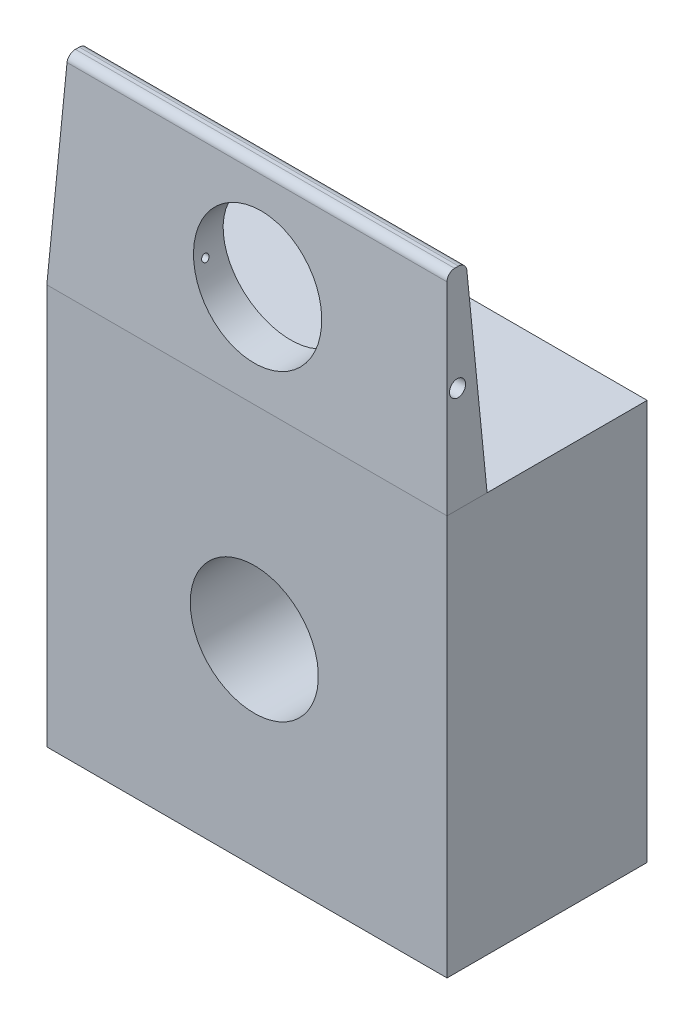
ISO-10303-21;
HEADER;
FILE_DESCRIPTION(('STEP AP214'),'2;1');
FILE_NAME('part.step','',(''),(''),'','','');
FILE_SCHEMA(('AUTOMOTIVE_DESIGN { 1 0 10303 214 1 1 1 1 }'));
ENDSEC;
DATA;
#1=APPLICATION_CONTEXT('core data for automotive mechanical design processes');
#2=APPLICATION_PROTOCOL_DEFINITION('international standard','automotive_design',2000,#1);
#3=PRODUCT_CONTEXT('',#1,'mechanical');
#4=PRODUCT('Part','Part','',(#3));
#5=PRODUCT_RELATED_PRODUCT_CATEGORY('part','',(#4));
#6=PRODUCT_DEFINITION_FORMATION('','',#4);
#7=PRODUCT_DEFINITION_CONTEXT('part definition',#1,'design');
#8=PRODUCT_DEFINITION('design','',#6,#7);
#9=PRODUCT_DEFINITION_SHAPE('','',#8);
#10=(LENGTH_UNIT() NAMED_UNIT(*) SI_UNIT(.MILLI.,.METRE.));
#11=(NAMED_UNIT(*) PLANE_ANGLE_UNIT() SI_UNIT($,.RADIAN.));
#12=(NAMED_UNIT(*) SI_UNIT($,.STERADIAN.) SOLID_ANGLE_UNIT());
#13=UNCERTAINTY_MEASURE_WITH_UNIT(LENGTH_MEASURE(1.E-05),#10,'distance_accuracy_value','');
#14=(GEOMETRIC_REPRESENTATION_CONTEXT(3) GLOBAL_UNCERTAINTY_ASSIGNED_CONTEXT((#13)) GLOBAL_UNIT_ASSIGNED_CONTEXT((#10,
#11,#12)) REPRESENTATION_CONTEXT('',''));
#15=CARTESIAN_POINT('',(0.,0.,0.));
#16=DIRECTION('',(0.,0.,1.));
#17=DIRECTION('',(1.,0.,0.));
#18=AXIS2_PLACEMENT_3D('',#15,#16,#17);
#19=CARTESIAN_POINT('',(90.8249405268785,103.104022899305,89.2888578511315));
#20=DIRECTION('',(0.998629534754574,0.0523359562429438,0.));
#21=DIRECTION('',(-0.0523359562429439,0.998629534754574,0.));
#22=AXIS2_PLACEMENT_3D('',#19,#20,#21);
#23=PLANE('',#22);
#24=CARTESIAN_POINT('',(89.5147460448025,128.104022899305,95.3565363077755));
#25=DIRECTION('',(0.998629534754574,0.0523359562429439,0.));
#26=DIRECTION('',(-0.0523359562429439,0.998629534754574,0.));
#27=AXIS2_PLACEMENT_3D('',#24,#25,#26);
#28=CIRCLE('',#27,2.);
#29=CARTESIAN_POINT('',(89.4100741323166,130.101281968814,95.3565363077755));
#30=VERTEX_POINT('',#29);
#31=EDGE_CURVE('P0_E131',#30,#30,#28,.T.);
#32=ORIENTED_EDGE('',*,*,#31,.F.);
#33=EDGE_LOOP('',(#32));
#34=FACE_BOUND('',#33,.T.);
#35=DIRECTION('',(0.0522644276887139,-0.997264688634237,-0.0522644276887139));
#36=VECTOR('',#35,1.);
#37=CARTESIAN_POINT('',(90.5517834867156,108.316169719868,89.5620148912944));
#38=LINE('',#37,#36);
#39=CARTESIAN_POINT('',(88.3038814988058,151.208694811791,91.8099168792042));
#40=VERTEX_POINT('',#39);
#41=CARTESIAN_POINT('',(90.8249405268785,103.104022899305,89.2888578511315));
#42=VERTEX_POINT('',#41);
#43=EDGE_CURVE('P0_E74',#40,#42,#38,.T.);
#44=ORIENTED_EDGE('',*,*,#43,.F.);
#45=CARTESIAN_POINT('',(88.3093671212925,151.104022899305,93.8071759487134));
#46=DIRECTION('',(0.998629534754574,0.0523359562429438,0.));
#47=DIRECTION('',(-0.0523359562429439,0.998629534754574,0.));
#48=AXIS2_PLACEMENT_3D('',#45,#46,#47);
#49=ELLIPSE('',#48,2.00274469199584,2.);
#50=CARTESIAN_POINT('',(88.2045515627264,153.104022899305,93.8071759487134));
#51=VERTEX_POINT('',#50);
#52=EDGE_CURVE('P0_E30',#40,#51,#49,.T.);
#53=ORIENTED_EDGE('',*,*,#52,.T.);
#54=DIRECTION('',(0.,0.,1.));
#55=VECTOR('',#54,1.);
#56=CARTESIAN_POINT('',(88.2045515627264,153.104022899305,89.2888578511315));
#57=LINE('',#56,#55);
#58=CARTESIAN_POINT('',(88.2045515627264,153.104022899305,94.7705397535497));
#59=VERTEX_POINT('',#58);
#60=EDGE_CURVE('P0_E104',#59,#51,#57,.F.);
#61=ORIENTED_EDGE('',*,*,#60,.F.);
#62=CARTESIAN_POINT('',(88.3093671212925,151.104022899305,94.7705397535497));
#63=DIRECTION('',(0.998629534754574,0.0523359562429438,0.));
#64=DIRECTION('',(0.0523359562429439,-0.998629534754574,0.));
#65=AXIS2_PLACEMENT_3D('',#62,#63,#64);
#66=ELLIPSE('',#65,2.00274469199584,2.);
#67=CARTESIAN_POINT('',(88.3038814988058,151.208694811791,96.7677988230589));
#68=VERTEX_POINT('',#67);
#69=EDGE_CURVE('P0_E38',#59,#68,#66,.T.);
#70=ORIENTED_EDGE('',*,*,#69,.T.);
#71=DIRECTION('',(0.0522644276887139,-0.997264688634237,0.0522644276887139));
#72=VECTOR('',#71,1.);
#73=CARTESIAN_POINT('',(90.7976248228622,103.625237581361,99.2615421471153));
#74=LINE('',#73,#72);
#75=CARTESIAN_POINT('',(90.8249405268785,103.104022899305,99.2888578511315));
#76=VERTEX_POINT('',#75);
#77=EDGE_CURVE('P0_E92',#68,#76,#74,.T.);
#78=ORIENTED_EDGE('',*,*,#77,.T.);
#79=DIRECTION('',(0.,0.,-1.));
#80=VECTOR('',#79,1.);
#81=CARTESIAN_POINT('',(90.8249405268785,103.104022899305,89.2888578511315));
#82=LINE('',#81,#80);
#83=EDGE_CURVE('P0_E88',#76,#42,#82,.T.);
#84=ORIENTED_EDGE('',*,*,#83,.T.);
#85=EDGE_LOOP('',(#44,#53,#61,#70,#78,#84));
#86=FACE_BOUND('',#85,.T.);
#87=ADVANCED_FACE('P0_F16',(#34,#86),#23,.T.);
#88=CARTESIAN_POINT('',(-9.17505947312153,103.104022899305,89.2888578511315));
#89=DIRECTION('',(0.,0.0523359562429438,-0.998629534754574));
#90=DIRECTION('',(0.,0.998629534754574,0.0523359562429439));
#91=AXIS2_PLACEMENT_3D('',#88,#89,#90);
#92=PLANE('',#91);
#93=CARTESIAN_POINT('',(42.2017689149086,128.069761268169,90.5972567572051));
#94=DIRECTION('',(0.,0.0523359562429439,-0.998629534754574));
#95=DIRECTION('',(0.,0.998629534754574,0.0523359562429439));
#96=AXIS2_PLACEMENT_3D('',#93,#94,#95);
#97=CIRCLE('',#96,16.);
#98=CARTESIAN_POINT('',(42.2017689149086,144.047833824243,91.4346320570922));
#99=VERTEX_POINT('',#98);
#100=EDGE_CURVE('P0_E97',#99,#99,#97,.T.);
#101=ORIENTED_EDGE('',*,*,#100,.F.);
#102=EDGE_LOOP('',(#101));
#103=FACE_BOUND('',#102,.T.);
#104=DIRECTION('',(-0.052264427688714,-0.997264688634237,-0.0522644276887139));
#105=VECTOR('',#104,1.);
#106=CARTESIAN_POINT('',(-9.17505947312153,103.104022899305,89.2888578511315));
#107=LINE('',#106,#105);
#108=CARTESIAN_POINT('',(-6.65400044504886,151.208694811791,91.8099168792042));
#109=VERTEX_POINT('',#108);
#110=CARTESIAN_POINT('',(-9.17505947312153,103.104022899305,89.2888578511315));
#111=VERTEX_POINT('',#110);
#112=EDGE_CURVE('P0_E82',#109,#111,#107,.T.);
#113=ORIENTED_EDGE('',*,*,#112,.F.);
#114=DIRECTION('',(-1.,0.,0.));
#115=VECTOR('',#114,1.);
#116=CARTESIAN_POINT('',(88.2045515627264,151.208694811791,91.8099168792042));
#117=LINE('',#116,#115);
#118=EDGE_CURVE('P0_E46',#109,#40,#117,.F.);
#119=ORIENTED_EDGE('',*,*,#118,.T.);
#120=ORIENTED_EDGE('',*,*,#43,.T.);
#121=DIRECTION('',(-1.,0.,0.));
#122=VECTOR('',#121,1.);
#123=CARTESIAN_POINT('',(-9.17505947312153,103.104022899305,89.2888578511315));
#124=LINE('',#123,#122);
#125=EDGE_CURVE('P0_E77',#42,#111,#124,.T.);
#126=ORIENTED_EDGE('',*,*,#125,.T.);
#127=EDGE_LOOP('',(#113,#119,#120,#126));
#128=FACE_BOUND('',#127,.T.);
#129=ADVANCED_FACE('P0_F76',(#103,#128),#92,.T.);
#130=CARTESIAN_POINT('',(-9.17505947312153,103.104022899305,89.2888578511315));
#131=DIRECTION('',(-0.998629534754574,0.0523359562429438,0.));
#132=DIRECTION('',(-0.0523359562429439,-0.998629534754574,0.));
#133=AXIS2_PLACEMENT_3D('',#130,#131,#132);
#134=PLANE('',#133);
#135=CARTESIAN_POINT('',(-8.13303374362537,122.987058275951,95.3565363077755));
#136=DIRECTION('',(-0.998629534754574,0.0523359562429438,0.));
#137=DIRECTION('',(0.0523359562429438,0.998629534754574,0.));
#138=AXIS2_PLACEMENT_3D('',#135,#136,#137);
#139=ELLIPSE('',#138,0.29482816245339,0.293212569488019);
#140=CARTESIAN_POINT('',(-8.11760362981602,123.281482386654,95.3565363077755));
#141=VERTEX_POINT('',#140);
#142=EDGE_CURVE('P0_E240',#141,#141,#139,.F.);
#143=ORIENTED_EDGE('',*,*,#142,.T.);
#144=EDGE_LOOP('',(#143));
#145=FACE_BOUND('',#144,.T.);
#146=DIRECTION('',(0.,0.,-1.));
#147=VECTOR('',#146,1.);
#148=CARTESIAN_POINT('',(-6.55467050896948,153.104022899305,89.2888578511315));
#149=LINE('',#148,#147);
#150=CARTESIAN_POINT('',(-6.55467050896948,153.104022899305,93.8071759487134));
#151=VERTEX_POINT('',#150);
#152=CARTESIAN_POINT('',(-6.55467050896947,153.104022899305,94.7705397535497));
#153=VERTEX_POINT('',#152);
#154=EDGE_CURVE('P0_E108',#151,#153,#149,.F.);
#155=ORIENTED_EDGE('',*,*,#154,.F.);
#156=CARTESIAN_POINT('',(-6.65948606753556,151.104022899305,93.8071759487134));
#157=DIRECTION('',(-0.998629534754574,0.0523359562429438,0.));
#158=DIRECTION('',(-0.0523359562429439,-0.998629534754574,0.));
#159=AXIS2_PLACEMENT_3D('',#156,#157,#158);
#160=ELLIPSE('',#159,2.00274469199584,2.);
#161=EDGE_CURVE('P0_E122',#151,#109,#160,.T.);
#162=ORIENTED_EDGE('',*,*,#161,.T.);
#163=ORIENTED_EDGE('',*,*,#112,.T.);
#164=DIRECTION('',(0.,0.,1.));
#165=VECTOR('',#164,1.);
#166=CARTESIAN_POINT('',(-9.17505947312153,103.104022899305,89.2888578511315));
#167=LINE('',#166,#165);
#168=CARTESIAN_POINT('',(-9.17505947312153,103.104022899305,99.2888578511315));
#169=VERTEX_POINT('',#168);
#170=EDGE_CURVE('P0_E90',#111,#169,#167,.T.);
#171=ORIENTED_EDGE('',*,*,#170,.T.);
#172=DIRECTION('',(-0.0522644276887139,-0.997264688634237,0.0522644276887139));
#173=VECTOR('',#172,1.);
#174=CARTESIAN_POINT('',(-9.17505947312153,103.104022899305,99.2888578511315));
#175=LINE('',#174,#173);
#176=CARTESIAN_POINT('',(-6.65400044504886,151.208694811791,96.7677988230589));
#177=VERTEX_POINT('',#176);
#178=EDGE_CURVE('P0_E107',#177,#169,#175,.T.);
#179=ORIENTED_EDGE('',*,*,#178,.F.);
#180=CARTESIAN_POINT('',(-6.65948606753555,151.104022899305,94.7705397535497));
#181=DIRECTION('',(-0.998629534754574,0.0523359562429438,0.));
#182=DIRECTION('',(0.0523359562429439,0.998629534754574,0.));
#183=AXIS2_PLACEMENT_3D('',#180,#181,#182);
#184=ELLIPSE('',#183,2.00274469199584,2.);
#185=EDGE_CURVE('P0_E120',#177,#153,#184,.T.);
#186=ORIENTED_EDGE('',*,*,#185,.T.);
#187=EDGE_LOOP('',(#155,#162,#163,#171,#179,#186));
#188=FACE_BOUND('',#187,.T.);
#189=ADVANCED_FACE('P0_F154',(#145,#188),#134,.T.);
#190=CARTESIAN_POINT('',(-9.17505947312153,103.104022899305,99.2888578511315));
#191=DIRECTION('',(0.,0.0523359562429438,0.998629534754574));
#192=DIRECTION('',(0.,-0.998629534754574,0.0523359562429439));
#193=AXIS2_PLACEMENT_3D('',#190,#191,#192);
#194=PLANE('',#193);
#195=CARTESIAN_POINT('',(42.2017689149086,127.681758358286,98.0007933159203));
#196=DIRECTION('',(0.,0.0523359562429438,0.998629534754574));
#197=DIRECTION('',(0.,0.998629534754574,-0.0523359562429439));
#198=AXIS2_PLACEMENT_3D('',#195,#196,#197);
#199=ELLIPSE('',#198,16.0881324730163,16.);
#200=CARTESIAN_POINT('',(42.2017689149086,143.747842604884,97.1588055187818));
#201=VERTEX_POINT('',#200);
#202=EDGE_CURVE('P0_E94',#201,#201,#199,.F.);
#203=ORIENTED_EDGE('',*,*,#202,.T.);
#204=EDGE_LOOP('',(#203));
#205=FACE_BOUND('',#204,.T.);
#206=ORIENTED_EDGE('',*,*,#77,.F.);
#207=DIRECTION('',(1.,0.,0.));
#208=VECTOR('',#207,1.);
#209=CARTESIAN_POINT('',(-6.55467050896946,151.208694811791,96.7677988230589));
#210=LINE('',#209,#208);
#211=EDGE_CURVE('P0_E10',#68,#177,#210,.F.);
#212=ORIENTED_EDGE('',*,*,#211,.T.);
#213=ORIENTED_EDGE('',*,*,#178,.T.);
#214=DIRECTION('',(1.,0.,0.));
#215=VECTOR('',#214,1.);
#216=CARTESIAN_POINT('',(-9.17505947312153,103.104022899305,99.2888578511315));
#217=LINE('',#216,#215);
#218=EDGE_CURVE('P0_E103',#169,#76,#217,.T.);
#219=ORIENTED_EDGE('',*,*,#218,.T.);
#220=EDGE_LOOP('',(#206,#212,#213,#219));
#221=FACE_BOUND('',#220,.T.);
#222=ADVANCED_FACE('P0_F160',(#205,#221),#194,.T.);
#223=CARTESIAN_POINT('',(40.8249405268785,153.104022899305,94.2888578511315));
#224=DIRECTION('',(0.,1.,0.));
#225=DIRECTION('',(0.,0.,1.));
#226=AXIS2_PLACEMENT_3D('',#223,#224,#225);
#227=PLANE('',#226);
#228=ORIENTED_EDGE('',*,*,#60,.T.);
#229=DIRECTION('',(1.,0.,0.));
#230=VECTOR('',#229,1.);
#231=CARTESIAN_POINT('',(-6.55467050896946,153.104022899305,93.8071759487134));
#232=LINE('',#231,#230);
#233=EDGE_CURVE('P0_E117',#51,#151,#232,.F.);
#234=ORIENTED_EDGE('',*,*,#233,.T.);
#235=ORIENTED_EDGE('',*,*,#154,.T.);
#236=DIRECTION('',(-1.,0.,0.));
#237=VECTOR('',#236,1.);
#238=CARTESIAN_POINT('',(88.2045515627264,153.104022899305,94.7705397535497));
#239=LINE('',#238,#237);
#240=EDGE_CURVE('P0_E81',#153,#59,#239,.F.);
#241=ORIENTED_EDGE('',*,*,#240,.T.);
#242=EDGE_LOOP('',(#228,#234,#235,#241));
#243=FACE_BOUND('',#242,.T.);
#244=ADVANCED_FACE('P0_F163',(#243),#227,.T.);
#245=CARTESIAN_POINT('',(40.8249405268785,103.104022899305,94.2888578511315));
#246=DIRECTION('',(0.,1.,0.));
#247=DIRECTION('',(0.,0.,1.));
#248=AXIS2_PLACEMENT_3D('',#245,#246,#247);
#249=PLANE('',#248);
#250=ORIENTED_EDGE('',*,*,#83,.F.);
#251=ORIENTED_EDGE('',*,*,#218,.F.);
#252=ORIENTED_EDGE('',*,*,#170,.F.);
#253=ORIENTED_EDGE('',*,*,#125,.F.);
#254=EDGE_LOOP('',(#250,#251,#252,#253));
#255=FACE_BOUND('',#254,.T.);
#256=ADVANCED_FACE('P0_F86',(#255),#249,.F.);
#257=CARTESIAN_POINT('',(40.8249405268785,151.104022899305,93.8071759487134));
#258=DIRECTION('',(-1.,0.,0.));
#259=DIRECTION('',(0.,0.,1.));
#260=AXIS2_PLACEMENT_3D('',#257,#258,#259);
#261=CYLINDRICAL_SURFACE('',#260,2.);
#262=ORIENTED_EDGE('',*,*,#52,.F.);
#263=ORIENTED_EDGE('',*,*,#118,.F.);
#264=ORIENTED_EDGE('',*,*,#161,.F.);
#265=ORIENTED_EDGE('',*,*,#233,.F.);
#266=EDGE_LOOP('',(#262,#263,#264,#265));
#267=FACE_BOUND('',#266,.T.);
#268=ADVANCED_FACE('P0_F167',(#267),#261,.T.);
#269=CARTESIAN_POINT('',(40.8249405268785,151.104022899305,94.7705397535497));
#270=DIRECTION('',(1.,0.,0.));
#271=DIRECTION('',(0.,0.,-1.));
#272=AXIS2_PLACEMENT_3D('',#269,#270,#271);
#273=CYLINDRICAL_SURFACE('',#272,2.);
#274=ORIENTED_EDGE('',*,*,#185,.F.);
#275=ORIENTED_EDGE('',*,*,#211,.F.);
#276=ORIENTED_EDGE('',*,*,#69,.F.);
#277=ORIENTED_EDGE('',*,*,#240,.F.);
#278=EDGE_LOOP('',(#274,#275,#276,#277));
#279=FACE_BOUND('',#278,.T.);
#280=ADVANCED_FACE('P0_F18',(#279),#273,.T.);
#281=CARTESIAN_POINT('',(42.2017689149086,125.452963456022,140.528733494934));
#282=DIRECTION('',(0.,0.0523359562429439,-0.998629534754574));
#283=DIRECTION('',(0.,0.998629534754574,0.0523359562429439));
#284=AXIS2_PLACEMENT_3D('',#281,#282,#283);
#285=CYLINDRICAL_SURFACE('',#284,16.);
#286=CARTESIAN_POINT('',(26.6196307910238,124.218271834449,94.6756667232217));
#287=CARTESIAN_POINT('',(26.6279675501686,124.180753576273,94.7082974656234));
#288=CARTESIAN_POINT('',(26.6357795470047,124.145879384237,94.7441523480832));
#289=CARTESIAN_POINT('',(26.6500012714397,124.082445380417,94.8213589319066));
#290=CARTESIAN_POINT('',(26.6564095994527,124.053891870632,94.8627160540739));
#291=CARTESIAN_POINT('',(26.6675145702616,124.003969225349,94.9497931300925));
#292=CARTESIAN_POINT('',(26.6722107437612,123.982602059733,94.9955142757829));
#293=CARTESIAN_POINT('',(26.6796509586733,123.947731140855,95.0900010396463));
#294=CARTESIAN_POINT('',(26.6823955245821,123.93422527504,95.1387658360003));
#295=CARTESIAN_POINT('',(26.6857717238884,123.915603537764,95.2373386195804));
#296=CARTESIAN_POINT('',(26.6864281753469,123.910389490391,95.2871272195898));
#297=CARTESIAN_POINT('',(26.6856647075258,123.908198579424,95.3868691438478));
#298=CARTESIAN_POINT('',(26.6842448168696,123.911221602279,95.4368224658162));
#299=CARTESIAN_POINT('',(26.6794183637063,123.925352408689,95.5351408155644));
#300=CARTESIAN_POINT('',(26.6760246546051,123.936407999585,95.5835140003801));
#301=CARTESIAN_POINT('',(26.6674298769446,123.966196836982,95.677663955649));
#302=CARTESIAN_POINT('',(26.6622287464894,123.98493034642,95.7234406371213));
#303=CARTESIAN_POINT('',(26.6502131443304,124.029712659688,95.8115513874514));
#304=CARTESIAN_POINT('',(26.6433847363172,124.055825037799,95.8538512203277));
#305=CARTESIAN_POINT('',(26.6284510493478,124.114534657453,95.9334256158435));
#306=CARTESIAN_POINT('',(26.6203456570602,124.147132474643,95.9706997319085));
#307=CARTESIAN_POINT('',(26.6030547022379,124.21851478584,96.0398445884039));
#308=CARTESIAN_POINT('',(26.5938529808559,124.257395906755,96.0716115485798));
#309=CARTESIAN_POINT('',(26.5748579859085,124.339847237635,96.1281039746689));
#310=CARTESIAN_POINT('',(26.5650646651234,124.383417822117,96.1528288776051));
#311=CARTESIAN_POINT('',(26.5451214036831,124.474654011071,96.1948499879453));
#312=CARTESIAN_POINT('',(26.5349684710244,124.522365810191,96.212044562462));
#313=CARTESIAN_POINT('',(26.514783624703,124.620049760917,96.2380381264594));
#314=CARTESIAN_POINT('',(26.5047517133888,124.670021956299,96.2468369532782));
#315=CARTESIAN_POINT('',(26.485103422404,124.77091565482,96.2557724550538));
#316=CARTESIAN_POINT('',(26.47548785606,124.821838760439,96.2558928779544));
#317=CARTESIAN_POINT('',(26.4569565053954,124.923078962762,96.2473859197309));
#318=CARTESIAN_POINT('',(26.4480406971466,124.973396080139,96.2387588378692));
#319=CARTESIAN_POINT('',(26.4311749799496,125.071603194146,96.2130531222236));
#320=CARTESIAN_POINT('',(26.4232187023861,125.119507805514,96.196034522743));
#321=CARTESIAN_POINT('',(26.4083445416777,125.211857845333,96.1540243807017));
#322=CARTESIAN_POINT('',(26.4014266087789,125.25630343948,96.1290332203387));
#323=CARTESIAN_POINT('',(26.3887774916437,125.340034680995,96.0720287879102));
#324=CARTESIAN_POINT('',(26.3830362673902,125.379362837827,96.0400801742255));
#325=CARTESIAN_POINT('',(26.3727096998926,125.452157912577,95.9699303489833));
#326=CARTESIAN_POINT('',(26.3681243175909,125.485625028536,95.9317293487749));
#327=CARTESIAN_POINT('',(26.3601484684975,125.545521833237,95.8504119656675));
#328=CARTESIAN_POINT('',(26.3567509145219,125.571993023501,95.8073268407941));
#329=CARTESIAN_POINT('',(26.3511085642865,125.61738679054,95.7172790555055));
#330=CARTESIAN_POINT('',(26.3488637487607,125.636309493474,95.670316459911));
#331=CARTESIAN_POINT('',(26.3455216075971,125.66601056555,95.5739863360079));
#332=CARTESIAN_POINT('',(26.3444211427856,125.676811192424,95.5246257777163));
#333=CARTESIAN_POINT('',(26.3433495879048,125.690040425167,95.4247833308879));
#334=CARTESIAN_POINT('',(26.3433784911328,125.692469080724,95.3743014490079));
#335=CARTESIAN_POINT('',(26.3445653117743,125.688887828656,95.2736882768616));
#336=CARTESIAN_POINT('',(26.3457224090579,125.682884049512,95.2235567585628));
#337=CARTESIAN_POINT('',(26.3491716088187,125.662628068914,95.1250296162938));
#338=CARTESIAN_POINT('',(26.3514637081266,125.648375890492,95.0766339874767));
#339=CARTESIAN_POINT('',(26.3571937378157,125.61203496715,94.9829268662053));
#340=CARTESIAN_POINT('',(26.3606322061601,125.589942542678,94.9376168337913));
#341=CARTESIAN_POINT('',(26.368657527431,125.538572409615,94.8513847878667));
#342=CARTESIAN_POINT('',(26.373244385079,125.509294671483,94.8104627923986));
#343=CARTESIAN_POINT('',(26.3835608310255,125.444351114786,94.7340814387652));
#344=CARTESIAN_POINT('',(26.3892925357856,125.408673477462,94.6986324168561));
#345=CARTESIAN_POINT('',(26.4018472097573,125.332009905008,94.6342716858808));
#346=CARTESIAN_POINT('',(26.408670197873,125.291023877923,94.6053600900828));
#347=CARTESIAN_POINT('',(26.423351397639,125.204742717486,94.5547494451942));
#348=CARTESIAN_POINT('',(26.4312139572179,125.159429721149,94.533082117533));
#349=CARTESIAN_POINT('',(26.4478116007863,125.065949720714,94.4977061621642));
#350=CARTESIAN_POINT('',(26.4565466852234,125.017782715153,94.4839975385383));
#351=CARTESIAN_POINT('',(26.4747624080462,124.919595187054,94.4648106766376));
#352=CARTESIAN_POINT('',(26.4842480384857,124.869563672759,94.4593934554382));
#353=CARTESIAN_POINT('',(26.5036583149768,124.769376583295,94.4570979601873));
#354=CARTESIAN_POINT('',(26.5135830867133,124.719220976539,94.4602221464923));
#355=CARTESIAN_POINT('',(26.5336546128486,124.619752737626,94.4749670185224));
#356=CARTESIAN_POINT('',(26.5438025536742,124.570451464822,94.4866625106745));
#357=CARTESIAN_POINT('',(26.5638761524619,124.474564135394,94.5182988332637));
#358=CARTESIAN_POINT('',(26.5738020403451,124.427975181803,94.5382306752128));
#359=CARTESIAN_POINT('',(26.589795424167,124.353898451098,94.5777178350712));
#360=CARTESIAN_POINT('',(26.596032643232,124.325278898054,94.5951213033899));
#361=CARTESIAN_POINT('',(26.6081365445423,124.270128568002,94.6330823737813));
#362=CARTESIAN_POINT('',(26.6140032259322,124.243597795815,94.6536399831343));
#363=CARTESIAN_POINT('',(26.6196307910238,124.218271834449,94.6756667232217));
#364=B_SPLINE_CURVE_WITH_KNOTS('',3,(#286,#287,#288,#289,#290,#291,#292,#293,#294,#295,#296,
#297,#298,#299,#300,#301,#302,#303,#304,#305,#306,#307,#308,#309,#310,#311,#312,#313,#314,#315,
#316,#317,#318,#319,#320,#321,#322,#323,#324,#325,#326,#327,#328,#329,#330,#331,#332,#333,#334,
#335,#336,#337,#338,#339,#340,#341,#342,#343,#344,#345,#346,#347,#348,#349,#350,#351,#352,#353,
#354,#355,#356,#357,#358,#359,#360,#361,#362,#363),.UNSPECIFIED.,.T.,.F.,(4,2,2,2,2,2,2,2,2,2,2,
2,2,2,2,2,2,2,2,2,2,2,2,2,2,2,2,2,2,2,2,2,2,2,2,2,2,2,4),(0.,0.151130020752963,
0.302410052815259,0.453731519165124,0.605012302360112,0.754488202651456,0.903962042359303,
1.05247324435254,1.20098953267467,1.35082659582127,1.50067696440857,1.65310061255813,
1.80553644279481,1.95997057782596,2.11440770485509,2.26913403895382,2.42385507986235,
2.57748493905001,2.7311074344616,2.88335894480899,3.0356053096666,3.18692713887168,
3.33824643889968,3.48914953713614,3.6400517397602,3.79084432720373,3.94163649359164,
4.09249952292607,4.24336317254092,4.39450834679322,4.545656139604,4.69745737025985,
4.84925867876842,5.00217182307906,5.155129018736,5.30943729622038,5.46357761697846,
5.56559472592908,5.66761207035711),.UNSPECIFIED.);
#365=CARTESIAN_POINT('',(26.6196307910238,124.218271834449,94.6756667232217));
#366=VERTEX_POINT('',#365);
#367=EDGE_CURVE('P0_E20',#366,#366,#364,.T.);
#368=ORIENTED_EDGE('',*,*,#367,.T.);
#369=EDGE_LOOP('',(#368));
#370=FACE_BOUND('',#369,.T.);
#371=CARTESIAN_POINT('',(58.0687433532065,125.827079439998,94.0498629838793));
#372=CARTESIAN_POINT('',(58.0781609377789,125.901637444818,94.0140578750202));
#373=CARTESIAN_POINT('',(58.087511719959,125.979283699782,93.9845335476651));
#374=CARTESIAN_POINT('',(58.1055708666439,126.138568486854,93.9389267125833));
#375=CARTESIAN_POINT('',(58.1142784898369,126.220211450872,93.9228595018363));
#376=CARTESIAN_POINT('',(58.1306440313513,126.385147701908,93.9047147056762));
#377=CARTESIAN_POINT('',(58.1383020137289,126.468440887862,93.9026362661994));
#378=CARTESIAN_POINT('',(58.1522959173595,126.634267601476,93.9126197922952));
#379=CARTESIAN_POINT('',(58.1586322202288,126.716801341819,93.9246776695296));
#380=CARTESIAN_POINT('',(58.1698173377254,126.878072993524,93.9625193198523));
#381=CARTESIAN_POINT('',(58.174677550828,126.95683581775,93.9881934767765));
#382=CARTESIAN_POINT('',(58.1829994916715,127.108944822667,94.0525365145586));
#383=CARTESIAN_POINT('',(58.1864612433151,127.182291095921,94.0912051732919));
#384=CARTESIAN_POINT('',(58.1921027890703,127.320623167029,94.1799701555085));
#385=CARTESIAN_POINT('',(58.1942962114613,127.385691750819,94.2299366493768));
#386=CARTESIAN_POINT('',(58.1976937633525,127.506505140736,94.3401221877234));
#387=CARTESIAN_POINT('',(58.1988979212673,127.562250214624,94.4003409376677));
#388=CARTESIAN_POINT('',(58.2005975257243,127.662585645098,94.5290331533396));
#389=CARTESIAN_POINT('',(58.2010960166807,127.707223230019,94.5974697688484));
#390=CARTESIAN_POINT('',(58.201679984064,127.784388169004,94.740861392783));
#391=CARTESIAN_POINT('',(58.2017654603925,127.816915520184,94.8158164027605));
#392=CARTESIAN_POINT('',(58.2017721905401,127.868958232935,94.9701618618152));
#393=CARTESIAN_POINT('',(58.2016933516298,127.888466238993,95.0495547907723));
#394=CARTESIAN_POINT('',(58.2015479708857,127.913895916732,95.2104876947177));
#395=CARTESIAN_POINT('',(58.2014814291566,127.919817472693,95.2920276879872));
#396=CARTESIAN_POINT('',(58.2014403571787,127.917909470857,95.4550547236345));
#397=CARTESIAN_POINT('',(58.2014659485874,127.910061738381,95.5365415537906));
#398=CARTESIAN_POINT('',(58.2015811250643,127.880802093486,95.6970426450574));
#399=CARTESIAN_POINT('',(58.2016707103286,127.859390139507,95.7760568985913));
#400=CARTESIAN_POINT('',(58.2017810546277,127.803596195464,95.9293943172554));
#401=CARTESIAN_POINT('',(58.20180179171,127.769210072422,96.0037159787238));
#402=CARTESIAN_POINT('',(58.2015550989821,127.688441018802,96.1455259263791));
#403=CARTESIAN_POINT('',(58.2012876710768,127.642058167528,96.2130142577336));
#404=CARTESIAN_POINT('',(58.200190306995,127.538655979539,96.3391876565431));
#405=CARTESIAN_POINT('',(58.1993608068255,127.481644912104,96.3978795044873));
#406=CARTESIAN_POINT('',(58.1968501010116,127.358595558982,96.5048581749667));
#407=CARTESIAN_POINT('',(58.1951689083037,127.292557410423,96.5531451555291));
#408=CARTESIAN_POINT('',(58.1906956015657,127.15341131306,96.6379273903122));
#409=CARTESIAN_POINT('',(58.1879043943026,127.080309171617,96.6744322253411));
#410=CARTESIAN_POINT('',(58.1810216195392,126.929092120826,96.7347125113463));
#411=CARTESIAN_POINT('',(58.1769300489139,126.850977199431,96.7584879317306));
#412=CARTESIAN_POINT('',(58.167350659601,126.691764494198,96.7927492505377));
#413=CARTESIAN_POINT('',(58.1618593581931,126.610659708134,96.8032016043134));
#414=CARTESIAN_POINT('',(58.1495301201981,126.447943678489,96.8104986473996));
#415=CARTESIAN_POINT('',(58.1426921202142,126.36633241124,96.8073426959445));
#416=CARTESIAN_POINT('',(58.1277850800153,126.20415237442,96.7875068882499));
#417=CARTESIAN_POINT('',(58.1197057478829,126.123599072698,96.7707084079374));
#418=CARTESIAN_POINT('',(58.1026796602982,125.966494953476,96.723969302935));
#419=CARTESIAN_POINT('',(58.0937328368217,125.88994445058,96.6940276469768));
#420=CARTESIAN_POINT('',(58.0753034859616,125.742114008673,96.6214471242019));
#421=CARTESIAN_POINT('',(58.0658161090095,125.670902120438,96.5786708077148));
#422=CARTESIAN_POINT('',(58.0469355487715,125.536693432666,96.4817193707521));
#423=CARTESIAN_POINT('',(58.0375423691774,125.473696953938,96.4275438053552));
#424=CARTESIAN_POINT('',(58.0194221098486,125.357611465745,96.3091314863375));
#425=CARTESIAN_POINT('',(58.0106964096324,125.304542663902,96.2448746907284));
#426=CARTESIAN_POINT('',(57.9945328076881,125.210080499542,96.1081379481421));
#427=CARTESIAN_POINT('',(57.9870948034334,125.168686207335,96.0356586566026));
#428=CARTESIAN_POINT('',(57.9741532893453,125.099419454443,95.8856445060701));
#429=CARTESIAN_POINT('',(57.9686228756266,125.071356636334,95.8081999365017));
#430=CARTESIAN_POINT('',(57.9597696905196,125.028798622639,95.649548866399));
#431=CARTESIAN_POINT('',(57.9564465869757,125.014301385573,95.5683429338423));
#432=CARTESIAN_POINT('',(57.9523180361351,124.999551839588,95.4064186334932));
#433=CARTESIAN_POINT('',(57.9514580205303,124.998988635502,95.3257298780071));
#434=CARTESIAN_POINT('',(57.9521653922696,125.011350853462,95.1654101333754));
#435=CARTESIAN_POINT('',(57.9537325144573,125.024274802031,95.0857790296436));
#436=CARTESIAN_POINT('',(57.9591443206494,125.062997170632,94.9306338175406));
#437=CARTESIAN_POINT('',(57.9629664763702,125.088667851633,94.8550869465706));
#438=CARTESIAN_POINT('',(57.9725876004588,125.152022449712,94.7093280328152));
#439=CARTESIAN_POINT('',(57.9783871225214,125.189709731443,94.6391174910304));
#440=CARTESIAN_POINT('',(57.9916347551108,125.276499667041,94.5050702002362));
#441=CARTESIAN_POINT('',(57.9991026317671,125.325739576823,94.4413244453633));
#442=CARTESIAN_POINT('',(58.0151313427271,125.4339082867,94.3229146120855));
#443=CARTESIAN_POINT('',(58.023691127895,125.492827801804,94.2682419305479));
#444=CARTESIAN_POINT('',(58.0384186521083,125.597735879715,94.1857865450081));
#445=CARTESIAN_POINT('',(58.0444349017845,125.641506031308,94.1551087851445));
#446=CARTESIAN_POINT('',(58.0565578283146,125.732114992913,94.0987026610955));
#447=CARTESIAN_POINT('',(58.0626645071079,125.778953868814,94.0729744032274));
#448=CARTESIAN_POINT('',(58.0687433532065,125.827079439998,94.0498629838793));
#449=B_SPLINE_CURVE_WITH_KNOTS('',3,(#371,#372,#373,#374,#375,#376,#377,#378,#379,#380,#381,
#382,#383,#384,#385,#386,#387,#388,#389,#390,#391,#392,#393,#394,#395,#396,#397,#398,#399,#400,
#401,#402,#403,#404,#405,#406,#407,#408,#409,#410,#411,#412,#413,#414,#415,#416,#417,#418,#419,
#420,#421,#422,#423,#424,#425,#426,#427,#428,#429,#430,#431,#432,#433,#434,#435,#436,#437,#438,
#439,#440,#441,#442,#443,#444,#445,#446,#447,#448),.UNSPECIFIED.,.T.,.F.,(4,2,2,2,2,2,2,2,2,2,2,
2,2,2,2,2,2,2,2,2,2,2,2,2,2,2,2,2,2,2,2,2,2,2,2,2,2,2,4),(0.,0.249538542733499,
0.499360357528357,0.749166919681704,0.998901253555157,1.2466549868725,1.4944044853654,
1.73943991144091,1.98446829915727,2.22843632082799,2.47240440057673,2.71651019805243,
2.96061807465909,3.20504840226801,3.44947947882201,3.69398848579243,3.93849587647356,
4.18281381623656,4.42712804508289,4.67124310308312,4.91535874774644,5.16008781738638,
5.40482841055179,5.65172014254351,5.89863125015243,6.14828716998417,6.39795283588701,
6.64812129044348,6.89826981738048,7.144730356556,7.3911537999766,7.63207397972088,
7.8729678416231,8.11149492514577,8.35008885506599,8.59167551705483,8.83303178007037,
8.99410002488512,9.15517172913062),.UNSPECIFIED.);
#450=CARTESIAN_POINT('',(58.0687433532065,125.827079439998,94.0498629838793));
#451=VERTEX_POINT('',#450);
#452=EDGE_CURVE('P0_E126',#451,#451,#449,.T.);
#453=ORIENTED_EDGE('',*,*,#452,.T.);
#454=EDGE_LOOP('',(#453));
#455=FACE_BOUND('',#454,.T.);
#456=ORIENTED_EDGE('',*,*,#100,.T.);
#457=EDGE_LOOP('',(#456));
#458=FACE_BOUND('',#457,.T.);
#459=ORIENTED_EDGE('',*,*,#202,.F.);
#460=EDGE_LOOP('',(#459));
#461=FACE_BOUND('',#460,.T.);
#462=ADVANCED_FACE('P0_F132',(#370,#455,#458,#461),#285,.F.);
#463=CARTESIAN_POINT('',(89.5147460448025,128.104022899305,95.3565363077755));
#464=DIRECTION('',(0.998629534754574,0.0523359562429439,0.));
#465=DIRECTION('',(-0.0523359562429439,0.998629534754574,0.));
#466=AXIS2_PLACEMENT_3D('',#463,#464,#465);
#467=CONICAL_SURFACE('',#466,2.,0.0174532925199433);
#468=ORIENTED_EDGE('',*,*,#31,.T.);
#469=EDGE_LOOP('',(#468));
#470=FACE_BOUND('',#469,.T.);
#471=ORIENTED_EDGE('',*,*,#452,.F.);
#472=EDGE_LOOP('',(#471));
#473=FACE_BOUND('',#472,.T.);
#474=ADVANCED_FACE('P0_F138',(#470,#473),#467,.F.);
#475=ORIENTED_EDGE('',*,*,#367,.F.);
#476=EDGE_LOOP('',(#475));
#477=FACE_BOUND('',#476,.T.);
#478=ORIENTED_EDGE('',*,*,#142,.F.);
#479=EDGE_LOOP('',(#478));
#480=FACE_BOUND('',#479,.T.);
#481=ADVANCED_FACE('P0_F135',(#477,#480),#467,.F.);
#482=CLOSED_SHELL('',(#87,#129,#189,#222,#244,#256,#268,#280,#462,#474,#481));
#483=MANIFOLD_SOLID_BREP('P0_B1',#482);
#484=CARTESIAN_POINT('',(-9.17505947312153,103.104022899305,49.2888578511315));
#485=DIRECTION('',(1.,0.,0.));
#486=DIRECTION('',(0.,0.,-1.));
#487=AXIS2_PLACEMENT_3D('',#484,#485,#486);
#488=PLANE('',#487);
#489=DIRECTION('',(0.,0.,1.));
#490=VECTOR('',#489,1.);
#491=CARTESIAN_POINT('',(-9.17505947312153,3.10402289930498,49.2888578511315));
#492=LINE('',#491,#490);
#493=CARTESIAN_POINT('',(-9.17505947312153,3.10402289930498,49.2888578511315));
#494=VERTEX_POINT('',#493);
#495=CARTESIAN_POINT('',(-9.17505947312152,3.10402289930498,99.2888578511315));
#496=VERTEX_POINT('',#495);
#497=EDGE_CURVE('P1_E80',#494,#496,#492,.T.);
#498=ORIENTED_EDGE('',*,*,#497,.T.);
#499=DIRECTION('',(0.,-1.,0.));
#500=VECTOR('',#499,1.);
#501=CARTESIAN_POINT('',(-9.17505947312152,103.104022899305,99.2888578511315));
#502=LINE('',#501,#500);
#503=CARTESIAN_POINT('',(-9.17505947312152,103.104022899305,99.2888578511315));
#504=VERTEX_POINT('',#503);
#505=EDGE_CURVE('P1_E11',#504,#496,#502,.T.);
#506=ORIENTED_EDGE('',*,*,#505,.F.);
#507=DIRECTION('',(0.,0.,1.));
#508=VECTOR('',#507,1.);
#509=CARTESIAN_POINT('',(-9.17505947312153,103.104022899305,49.2888578511315));
#510=LINE('',#509,#508);
#511=CARTESIAN_POINT('',(-9.17505947312153,103.104022899305,49.2888578511315));
#512=VERTEX_POINT('',#511);
#513=EDGE_CURVE('P1_E68',#512,#504,#510,.T.);
#514=ORIENTED_EDGE('',*,*,#513,.F.);
#515=DIRECTION('',(0.,-1.,0.));
#516=VECTOR('',#515,1.);
#517=CARTESIAN_POINT('',(-9.17505947312153,103.104022899305,49.2888578511315));
#518=LINE('',#517,#516);
#519=EDGE_CURVE('P1_E76',#512,#494,#518,.T.);
#520=ORIENTED_EDGE('',*,*,#519,.T.);
#521=EDGE_LOOP('',(#498,#506,#514,#520));
#522=FACE_BOUND('',#521,.T.);
#523=ADVANCED_FACE('P1_F17',(#522),#488,.F.);
#524=CARTESIAN_POINT('',(-9.17505947312152,103.104022899305,99.2888578511315));
#525=DIRECTION('',(0.,0.,-1.));
#526=DIRECTION('',(-1.,0.,0.));
#527=AXIS2_PLACEMENT_3D('',#524,#525,#526);
#528=PLANE('',#527);
#529=CARTESIAN_POINT('',(42.6653428533478,52.3027868063471,99.2888578511315));
#530=DIRECTION('',(0.,0.,-1.));
#531=DIRECTION('',(-1.,0.,0.));
#532=AXIS2_PLACEMENT_3D('',#529,#530,#531);
#533=CIRCLE('',#532,16.);
#534=CARTESIAN_POINT('',(26.6653428533478,52.3027868063471,99.2888578511315));
#535=VERTEX_POINT('',#534);
#536=EDGE_CURVE('P1_E83',#535,#535,#533,.T.);
#537=ORIENTED_EDGE('',*,*,#536,.T.);
#538=EDGE_LOOP('',(#537));
#539=FACE_BOUND('',#538,.T.);
#540=DIRECTION('',(1.,0.,0.));
#541=VECTOR('',#540,1.);
#542=CARTESIAN_POINT('',(-9.17505947312152,3.10402289930498,99.2888578511315));
#543=LINE('',#542,#541);
#544=CARTESIAN_POINT('',(90.8249405268785,3.10402289930498,99.2888578511315));
#545=VERTEX_POINT('',#544);
#546=EDGE_CURVE('P1_E72',#496,#545,#543,.T.);
#547=ORIENTED_EDGE('',*,*,#546,.T.);
#548=DIRECTION('',(0.,-1.,0.));
#549=VECTOR('',#548,1.);
#550=CARTESIAN_POINT('',(90.8249405268785,103.104022899305,99.2888578511315));
#551=LINE('',#550,#549);
#552=CARTESIAN_POINT('',(90.8249405268785,103.104022899305,99.2888578511315));
#553=VERTEX_POINT('',#552);
#554=EDGE_CURVE('P1_E25',#553,#545,#551,.T.);
#555=ORIENTED_EDGE('',*,*,#554,.F.);
#556=DIRECTION('',(1.,0.,0.));
#557=VECTOR('',#556,1.);
#558=CARTESIAN_POINT('',(-9.17505947312152,103.104022899305,99.2888578511315));
#559=LINE('',#558,#557);
#560=EDGE_CURVE('P1_E63',#504,#553,#559,.T.);
#561=ORIENTED_EDGE('',*,*,#560,.F.);
#562=ORIENTED_EDGE('',*,*,#505,.T.);
#563=EDGE_LOOP('',(#547,#555,#561,#562));
#564=FACE_BOUND('',#563,.T.);
#565=ADVANCED_FACE('P1_F71',(#539,#564),#528,.F.);
#566=CARTESIAN_POINT('',(90.8249405268785,103.104022899305,49.2888578511315));
#567=DIRECTION('',(-1.,0.,0.));
#568=DIRECTION('',(0.,0.,1.));
#569=AXIS2_PLACEMENT_3D('',#566,#567,#568);
#570=PLANE('',#569);
#571=DIRECTION('',(0.,0.,-1.));
#572=VECTOR('',#571,1.);
#573=CARTESIAN_POINT('',(90.8249405268785,3.10402289930498,49.2888578511315));
#574=LINE('',#573,#572);
#575=CARTESIAN_POINT('',(90.8249405268785,3.10402289930498,49.2888578511315));
#576=VERTEX_POINT('',#575);
#577=EDGE_CURVE('P1_E50',#545,#576,#574,.T.);
#578=ORIENTED_EDGE('',*,*,#577,.T.);
#579=DIRECTION('',(0.,-1.,0.));
#580=VECTOR('',#579,1.);
#581=CARTESIAN_POINT('',(90.8249405268785,103.104022899305,49.2888578511315));
#582=LINE('',#581,#580);
#583=CARTESIAN_POINT('',(90.8249405268785,103.104022899305,49.2888578511315));
#584=VERTEX_POINT('',#583);
#585=EDGE_CURVE('P1_E73',#584,#576,#582,.T.);
#586=ORIENTED_EDGE('',*,*,#585,.F.);
#587=DIRECTION('',(0.,0.,-1.));
#588=VECTOR('',#587,1.);
#589=CARTESIAN_POINT('',(90.8249405268785,103.104022899305,49.2888578511315));
#590=LINE('',#589,#588);
#591=EDGE_CURVE('P1_E66',#553,#584,#590,.T.);
#592=ORIENTED_EDGE('',*,*,#591,.F.);
#593=ORIENTED_EDGE('',*,*,#554,.T.);
#594=EDGE_LOOP('',(#578,#586,#592,#593));
#595=FACE_BOUND('',#594,.T.);
#596=ADVANCED_FACE('P1_F74',(#595),#570,.F.);
#597=CARTESIAN_POINT('',(-9.17505947312153,103.104022899305,49.2888578511315));
#598=DIRECTION('',(0.,0.,1.));
#599=DIRECTION('',(1.,0.,0.));
#600=AXIS2_PLACEMENT_3D('',#597,#598,#599);
#601=PLANE('',#600);
#602=CARTESIAN_POINT('',(42.6653428533478,52.3027868063471,49.2888578511315));
#603=DIRECTION('',(0.,0.,-1.));
#604=DIRECTION('',(-1.,0.,0.));
#605=AXIS2_PLACEMENT_3D('',#602,#603,#604);
#606=CIRCLE('',#605,16.);
#607=CARTESIAN_POINT('',(26.6653428533478,52.3027868063471,49.2888578511315));
#608=VERTEX_POINT('',#607);
#609=EDGE_CURVE('P1_E96',#608,#608,#606,.T.);
#610=ORIENTED_EDGE('',*,*,#609,.F.);
#611=EDGE_LOOP('',(#610));
#612=FACE_BOUND('',#611,.T.);
#613=DIRECTION('',(-1.,0.,0.));
#614=VECTOR('',#613,1.);
#615=CARTESIAN_POINT('',(-9.17505947312153,3.10402289930498,49.2888578511315));
#616=LINE('',#615,#614);
#617=EDGE_CURVE('P1_E56',#576,#494,#616,.T.);
#618=ORIENTED_EDGE('',*,*,#617,.T.);
#619=ORIENTED_EDGE('',*,*,#519,.F.);
#620=DIRECTION('',(-1.,0.,0.));
#621=VECTOR('',#620,1.);
#622=CARTESIAN_POINT('',(-9.17505947312153,103.104022899305,49.2888578511315));
#623=LINE('',#622,#621);
#624=EDGE_CURVE('P1_E33',#584,#512,#623,.T.);
#625=ORIENTED_EDGE('',*,*,#624,.F.);
#626=ORIENTED_EDGE('',*,*,#585,.T.);
#627=EDGE_LOOP('',(#618,#619,#625,#626));
#628=FACE_BOUND('',#627,.T.);
#629=ADVANCED_FACE('P1_F88',(#612,#628),#601,.F.);
#630=CARTESIAN_POINT('',(-9.17505947312153,103.104022899305,49.2888578511315));
#631=DIRECTION('',(0.,1.,0.));
#632=DIRECTION('',(0.,0.,1.));
#633=AXIS2_PLACEMENT_3D('',#630,#631,#632);
#634=PLANE('',#633);
#635=ORIENTED_EDGE('',*,*,#513,.T.);
#636=ORIENTED_EDGE('',*,*,#560,.T.);
#637=ORIENTED_EDGE('',*,*,#591,.T.);
#638=ORIENTED_EDGE('',*,*,#624,.T.);
#639=EDGE_LOOP('',(#635,#636,#637,#638));
#640=FACE_BOUND('',#639,.T.);
#641=ADVANCED_FACE('P1_F64',(#640),#634,.T.);
#642=CARTESIAN_POINT('',(-9.17505947312153,3.10402289930498,49.2888578511315));
#643=DIRECTION('',(0.,1.,0.));
#644=DIRECTION('',(0.,0.,1.));
#645=AXIS2_PLACEMENT_3D('',#642,#643,#644);
#646=PLANE('',#645);
#647=ORIENTED_EDGE('',*,*,#497,.F.);
#648=ORIENTED_EDGE('',*,*,#617,.F.);
#649=ORIENTED_EDGE('',*,*,#577,.F.);
#650=ORIENTED_EDGE('',*,*,#546,.F.);
#651=EDGE_LOOP('',(#647,#648,#649,#650));
#652=FACE_BOUND('',#651,.T.);
#653=ADVANCED_FACE('P1_F91',(#652),#646,.F.);
#654=CARTESIAN_POINT('',(42.6653428533478,52.3027868063471,149.288857851132));
#655=DIRECTION('',(0.,0.,-1.));
#656=DIRECTION('',(-1.,0.,0.));
#657=AXIS2_PLACEMENT_3D('',#654,#655,#656);
#658=CYLINDRICAL_SURFACE('',#657,16.);
#659=ORIENTED_EDGE('',*,*,#609,.T.);
#660=EDGE_LOOP('',(#659));
#661=FACE_BOUND('',#660,.T.);
#662=ORIENTED_EDGE('',*,*,#536,.F.);
#663=EDGE_LOOP('',(#662));
#664=FACE_BOUND('',#663,.T.);
#665=ADVANCED_FACE('P1_F100',(#661,#664),#658,.F.);
#666=CLOSED_SHELL('',(#523,#565,#596,#629,#641,#653,#665));
#667=MANIFOLD_SOLID_BREP('P1_B1',#666);
#668=ADVANCED_BREP_SHAPE_REPRESENTATION('',(#18,#483,#667),#14);
#669=SHAPE_DEFINITION_REPRESENTATION(#9,#668);
ENDSEC;
END-ISO-10303-21;
